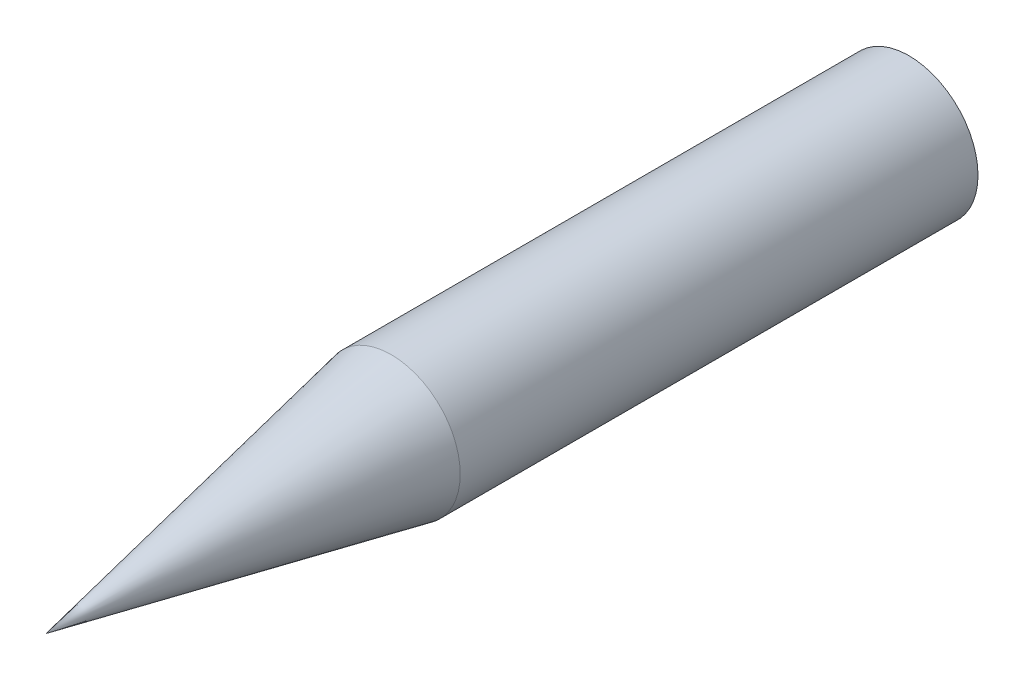
ISO-10303-21;
HEADER;
FILE_DESCRIPTION(('STEP AP214'),'2;1');
FILE_NAME('part.step','',(''),(''),'','','');
FILE_SCHEMA(('AUTOMOTIVE_DESIGN { 1 0 10303 214 1 1 1 1 }'));
ENDSEC;
DATA;
#1=APPLICATION_CONTEXT('core data for automotive mechanical design processes');
#2=APPLICATION_PROTOCOL_DEFINITION('international standard','automotive_design',2000,#1);
#3=PRODUCT_CONTEXT('',#1,'mechanical');
#4=PRODUCT('Part','Part','',(#3));
#5=PRODUCT_RELATED_PRODUCT_CATEGORY('part','',(#4));
#6=PRODUCT_DEFINITION_FORMATION('','',#4);
#7=PRODUCT_DEFINITION_CONTEXT('part definition',#1,'design');
#8=PRODUCT_DEFINITION('design','',#6,#7);
#9=PRODUCT_DEFINITION_SHAPE('','',#8);
#10=(LENGTH_UNIT() NAMED_UNIT(*) SI_UNIT(.MILLI.,.METRE.));
#11=(NAMED_UNIT(*) PLANE_ANGLE_UNIT() SI_UNIT($,.RADIAN.));
#12=(NAMED_UNIT(*) SI_UNIT($,.STERADIAN.) SOLID_ANGLE_UNIT());
#13=UNCERTAINTY_MEASURE_WITH_UNIT(LENGTH_MEASURE(1.E-05),#10,'distance_accuracy_value','');
#14=(GEOMETRIC_REPRESENTATION_CONTEXT(3) GLOBAL_UNCERTAINTY_ASSIGNED_CONTEXT((#13)) GLOBAL_UNIT_ASSIGNED_CONTEXT((#10,
#11,#12)) REPRESENTATION_CONTEXT('',''));
#15=CARTESIAN_POINT('',(0.,0.,0.));
#16=DIRECTION('',(0.,0.,1.));
#17=DIRECTION('',(1.,0.,0.));
#18=AXIS2_PLACEMENT_3D('',#15,#16,#17);
#19=CARTESIAN_POINT('',(0.,0.,50.));
#20=DIRECTION('',(0.,0.,-1.));
#21=DIRECTION('',(-1.,0.,0.));
#22=AXIS2_PLACEMENT_3D('',#19,#20,#21);
#23=CYLINDRICAL_SURFACE('',#22,4.);
#24=CARTESIAN_POINT('',(0.,0.,29.9999999999997));
#25=DIRECTION('',(0.,0.,1.));
#26=DIRECTION('',(1.,0.,0.));
#27=AXIS2_PLACEMENT_3D('',#24,#25,#26);
#28=CIRCLE('',#27,4.);
#29=CARTESIAN_POINT('',(4.,0.,29.9999999999997));
#30=VERTEX_POINT('',#29);
#31=EDGE_CURVE('E11',#30,#30,#28,.F.);
#32=ORIENTED_EDGE('',*,*,#31,.T.);
#33=EDGE_LOOP('',(#32));
#34=FACE_BOUND('',#33,.T.);
#35=CARTESIAN_POINT('',(0.,0.,0.));
#36=DIRECTION('',(0.,0.,1.));
#37=DIRECTION('',(1.,0.,0.));
#38=AXIS2_PLACEMENT_3D('',#35,#36,#37);
#39=CIRCLE('',#38,4.);
#40=CARTESIAN_POINT('',(4.,0.,0.));
#41=VERTEX_POINT('',#40);
#42=EDGE_CURVE('E40',#41,#41,#39,.T.);
#43=ORIENTED_EDGE('',*,*,#42,.T.);
#44=EDGE_LOOP('',(#43));
#45=FACE_BOUND('',#44,.T.);
#46=ADVANCED_FACE('F33',(#34,#45),#23,.T.);
#47=CARTESIAN_POINT('',(0.,0.,0.));
#48=DIRECTION('',(0.,0.,1.));
#49=DIRECTION('',(1.,0.,0.));
#50=AXIS2_PLACEMENT_3D('',#47,#48,#49);
#51=PLANE('',#50);
#52=ORIENTED_EDGE('',*,*,#42,.F.);
#53=EDGE_LOOP('',(#52));
#54=FACE_BOUND('',#53,.T.);
#55=ADVANCED_FACE('F44',(#54),#51,.F.);
#56=CARTESIAN_POINT('',(0.,0.,29.9999999999997));
#57=DIRECTION('',(0.,0.,-1.));
#58=DIRECTION('',(-1.,0.,0.));
#59=AXIS2_PLACEMENT_3D('',#56,#57,#58);
#60=CONICAL_SURFACE('',#59,4.,0.197395559849877);
#61=ORIENTED_EDGE('',*,*,#31,.F.);
#62=EDGE_LOOP('',(#61));
#63=FACE_BOUND('',#62,.T.);
#64=CARTESIAN_POINT('',(0.,0.,50.));
#65=VERTEX_POINT('',#64);
#66=VERTEX_LOOP('',#65);
#67=FACE_BOUND('',#66,.T.);
#68=ADVANCED_FACE('F35',(#63,#67),#60,.T.);
#69=CLOSED_SHELL('',(#46,#55,#68));
#70=MANIFOLD_SOLID_BREP('B2',#69);
#71=ADVANCED_BREP_SHAPE_REPRESENTATION('',(#18,#70),#14);
#72=SHAPE_DEFINITION_REPRESENTATION(#9,#71);
ENDSEC;
END-ISO-10303-21;
